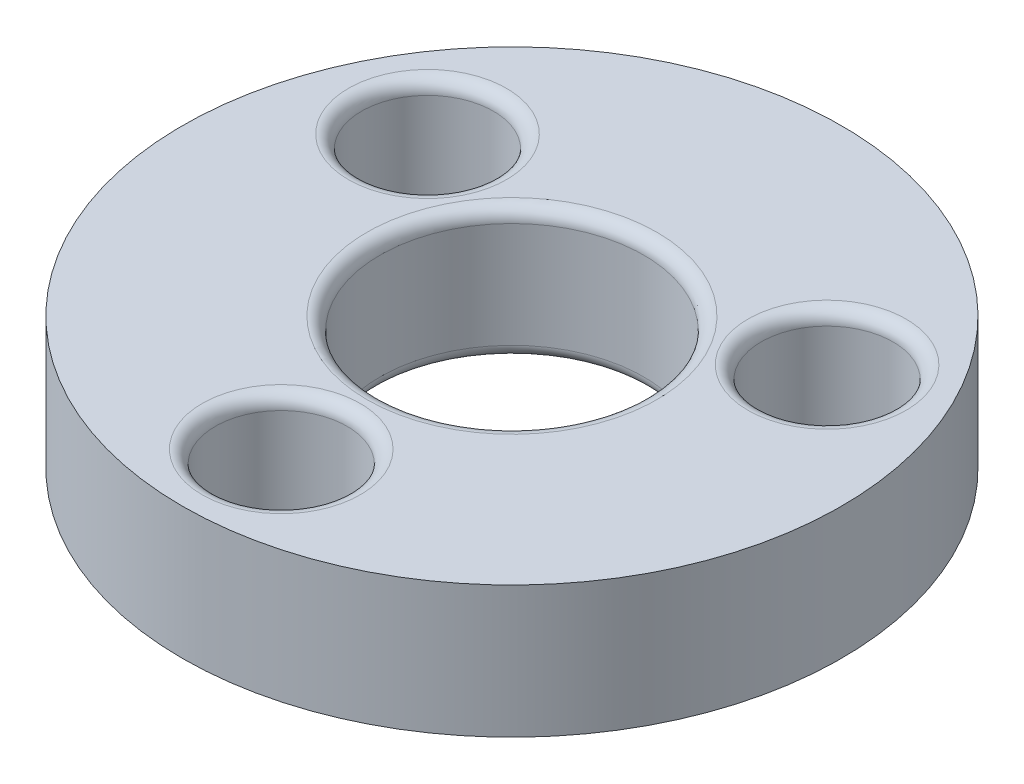
ISO-10303-21;
HEADER;
FILE_DESCRIPTION(('STEP AP214'),'2;1');
FILE_NAME('part.step','',(''),(''),'','','');
FILE_SCHEMA(('AUTOMOTIVE_DESIGN { 1 0 10303 214 1 1 1 1 }'));
ENDSEC;
DATA;
#1=APPLICATION_CONTEXT('core data for automotive mechanical design processes');
#2=APPLICATION_PROTOCOL_DEFINITION('international standard','automotive_design',2000,#1);
#3=PRODUCT_CONTEXT('',#1,'mechanical');
#4=PRODUCT('Part','Part','',(#3));
#5=PRODUCT_RELATED_PRODUCT_CATEGORY('part','',(#4));
#6=PRODUCT_DEFINITION_FORMATION('','',#4);
#7=PRODUCT_DEFINITION_CONTEXT('part definition',#1,'design');
#8=PRODUCT_DEFINITION('design','',#6,#7);
#9=PRODUCT_DEFINITION_SHAPE('','',#8);
#10=(LENGTH_UNIT() NAMED_UNIT(*) SI_UNIT(.MILLI.,.METRE.));
#11=(NAMED_UNIT(*) PLANE_ANGLE_UNIT() SI_UNIT($,.RADIAN.));
#12=(NAMED_UNIT(*) SI_UNIT($,.STERADIAN.) SOLID_ANGLE_UNIT());
#13=UNCERTAINTY_MEASURE_WITH_UNIT(LENGTH_MEASURE(1.E-05),#10,'distance_accuracy_value','');
#14=(GEOMETRIC_REPRESENTATION_CONTEXT(3) GLOBAL_UNCERTAINTY_ASSIGNED_CONTEXT((#13)) GLOBAL_UNIT_ASSIGNED_CONTEXT((#10,
#11,#12)) REPRESENTATION_CONTEXT('',''));
#15=CARTESIAN_POINT('',(0.,0.,0.));
#16=DIRECTION('',(0.,0.,1.));
#17=DIRECTION('',(1.,0.,0.));
#18=AXIS2_PLACEMENT_3D('',#15,#16,#17);
#19=CARTESIAN_POINT('',(0.,10.,0.));
#20=DIRECTION('',(0.,1.,0.));
#21=DIRECTION('',(0.,0.,1.));
#22=AXIS2_PLACEMENT_3D('',#19,#20,#21);
#23=PLANE('',#22);
#24=CARTESIAN_POINT('',(0.,10.,0.));
#25=DIRECTION('',(0.,1.,0.));
#26=DIRECTION('',(0.,0.,1.));
#27=AXIS2_PLACEMENT_3D('',#24,#25,#26);
#28=CIRCLE('',#27,11.);
#29=CARTESIAN_POINT('',(0.,10.,11.));
#30=VERTEX_POINT('',#29);
#31=EDGE_CURVE('E61',#30,#30,#28,.F.);
#32=ORIENTED_EDGE('',*,*,#31,.T.);
#33=EDGE_LOOP('',(#32));
#34=FACE_BOUND('',#33,.T.);
#35=CARTESIAN_POINT('',(0.,10.,17.5));
#36=DIRECTION('',(0.,1.,0.));
#37=DIRECTION('',(0.,0.,1.));
#38=AXIS2_PLACEMENT_3D('',#35,#36,#37);
#39=CIRCLE('',#38,6.);
#40=CARTESIAN_POINT('',(0.,10.,23.5));
#41=VERTEX_POINT('',#40);
#42=EDGE_CURVE('E64',#41,#41,#39,.F.);
#43=ORIENTED_EDGE('',*,*,#42,.T.);
#44=EDGE_LOOP('',(#43));
#45=FACE_BOUND('',#44,.T.);
#46=CARTESIAN_POINT('',(-15.1554445662266,10.,-8.75000000000065));
#47=DIRECTION('',(0.,1.,0.));
#48=DIRECTION('',(0.,0.,1.));
#49=AXIS2_PLACEMENT_3D('',#46,#47,#48);
#50=CIRCLE('',#49,6.00000000000141);
#51=CARTESIAN_POINT('',(-15.1554445662266,10.,-2.74999999999924));
#52=VERTEX_POINT('',#51);
#53=EDGE_CURVE('E67',#52,#52,#50,.F.);
#54=ORIENTED_EDGE('',*,*,#53,.T.);
#55=EDGE_LOOP('',(#54));
#56=FACE_BOUND('',#55,.T.);
#57=CARTESIAN_POINT('',(15.1554445662288,10.,-8.74999999999936));
#58=DIRECTION('',(0.,1.,0.));
#59=DIRECTION('',(0.,0.,1.));
#60=AXIS2_PLACEMENT_3D('',#57,#58,#59);
#61=CIRCLE('',#60,6.00000000000096);
#62=CARTESIAN_POINT('',(15.1554445662288,10.,-2.7499999999984));
#63=VERTEX_POINT('',#62);
#64=EDGE_CURVE('E70',#63,#63,#61,.F.);
#65=ORIENTED_EDGE('',*,*,#64,.T.);
#66=EDGE_LOOP('',(#65));
#67=FACE_BOUND('',#66,.T.);
#68=CARTESIAN_POINT('',(0.,10.,0.));
#69=DIRECTION('',(0.,1.,0.));
#70=DIRECTION('',(0.,0.,1.));
#71=AXIS2_PLACEMENT_3D('',#68,#69,#70);
#72=CIRCLE('',#71,25.);
#73=CARTESIAN_POINT('',(0.,10.,25.));
#74=VERTEX_POINT('',#73);
#75=EDGE_CURVE('E91',#74,#74,#72,.T.);
#76=ORIENTED_EDGE('',*,*,#75,.T.);
#77=EDGE_LOOP('',(#76));
#78=FACE_BOUND('',#77,.T.);
#79=ADVANCED_FACE('F35',(#34,#45,#56,#67,#78),#23,.T.);
#80=CARTESIAN_POINT('',(0.,0.,0.));
#81=DIRECTION('',(0.,1.,0.));
#82=DIRECTION('',(0.,0.,1.));
#83=AXIS2_PLACEMENT_3D('',#80,#81,#82);
#84=PLANE('',#83);
#85=CARTESIAN_POINT('',(0.,0.,0.));
#86=DIRECTION('',(0.,1.,0.));
#87=DIRECTION('',(0.,0.,1.));
#88=AXIS2_PLACEMENT_3D('',#85,#86,#87);
#89=CIRCLE('',#88,11.);
#90=CARTESIAN_POINT('',(0.,0.,11.));
#91=VERTEX_POINT('',#90);
#92=EDGE_CURVE('E79',#91,#91,#89,.T.);
#93=ORIENTED_EDGE('',*,*,#92,.T.);
#94=EDGE_LOOP('',(#93));
#95=FACE_BOUND('',#94,.T.);
#96=CARTESIAN_POINT('',(0.,0.,17.5));
#97=DIRECTION('',(0.,1.,0.));
#98=DIRECTION('',(0.,0.,1.));
#99=AXIS2_PLACEMENT_3D('',#96,#97,#98);
#100=CIRCLE('',#99,6.);
#101=CARTESIAN_POINT('',(0.,0.,23.5));
#102=VERTEX_POINT('',#101);
#103=EDGE_CURVE('E82',#102,#102,#100,.T.);
#104=ORIENTED_EDGE('',*,*,#103,.T.);
#105=EDGE_LOOP('',(#104));
#106=FACE_BOUND('',#105,.T.);
#107=CARTESIAN_POINT('',(-15.1554445662266,0.,-8.75000000000065));
#108=DIRECTION('',(0.,1.,0.));
#109=DIRECTION('',(0.,0.,1.));
#110=AXIS2_PLACEMENT_3D('',#107,#108,#109);
#111=CIRCLE('',#110,6.00000000000141);
#112=CARTESIAN_POINT('',(-15.1554445662266,0.,-2.74999999999924));
#113=VERTEX_POINT('',#112);
#114=EDGE_CURVE('E85',#113,#113,#111,.T.);
#115=ORIENTED_EDGE('',*,*,#114,.T.);
#116=EDGE_LOOP('',(#115));
#117=FACE_BOUND('',#116,.T.);
#118=CARTESIAN_POINT('',(15.1554445662288,0.,-8.74999999999936));
#119=DIRECTION('',(0.,1.,0.));
#120=DIRECTION('',(0.,0.,1.));
#121=AXIS2_PLACEMENT_3D('',#118,#119,#120);
#122=CIRCLE('',#121,6.00000000000096);
#123=CARTESIAN_POINT('',(15.1554445662288,0.,-2.7499999999984));
#124=VERTEX_POINT('',#123);
#125=EDGE_CURVE('E88',#124,#124,#122,.T.);
#126=ORIENTED_EDGE('',*,*,#125,.T.);
#127=EDGE_LOOP('',(#126));
#128=FACE_BOUND('',#127,.T.);
#129=CARTESIAN_POINT('',(0.,0.,0.));
#130=DIRECTION('',(0.,1.,0.));
#131=DIRECTION('',(0.,0.,1.));
#132=AXIS2_PLACEMENT_3D('',#129,#130,#131);
#133=CIRCLE('',#132,25.);
#134=CARTESIAN_POINT('',(0.,0.,25.));
#135=VERTEX_POINT('',#134);
#136=EDGE_CURVE('E92',#135,#135,#133,.T.);
#137=ORIENTED_EDGE('',*,*,#136,.F.);
#138=EDGE_LOOP('',(#137));
#139=FACE_BOUND('',#138,.T.);
#140=ADVANCED_FACE('F103',(#95,#106,#117,#128,#139),#84,.F.);
#141=CARTESIAN_POINT('',(0.,10.,0.));
#142=DIRECTION('',(0.,-1.,0.));
#143=DIRECTION('',(0.,0.,-1.));
#144=AXIS2_PLACEMENT_3D('',#141,#142,#143);
#145=CYLINDRICAL_SURFACE('',#144,25.);
#146=ORIENTED_EDGE('',*,*,#75,.F.);
#147=EDGE_LOOP('',(#146));
#148=FACE_BOUND('',#147,.T.);
#149=ORIENTED_EDGE('',*,*,#136,.T.);
#150=EDGE_LOOP('',(#149));
#151=FACE_BOUND('',#150,.T.);
#152=ADVANCED_FACE('F99',(#148,#151),#145,.T.);
#153=CARTESIAN_POINT('',(0.,10.,0.));
#154=DIRECTION('',(0.,-1.,0.));
#155=DIRECTION('',(0.,0.,-1.));
#156=AXIS2_PLACEMENT_3D('',#153,#154,#155);
#157=CYLINDRICAL_SURFACE('',#156,10.);
#158=CARTESIAN_POINT('',(0.,0.999999999999999,0.));
#159=DIRECTION('',(0.,1.,0.));
#160=DIRECTION('',(0.,0.,1.));
#161=AXIS2_PLACEMENT_3D('',#158,#159,#160);
#162=CIRCLE('',#161,10.);
#163=CARTESIAN_POINT('',(0.,0.999999999999999,10.));
#164=VERTEX_POINT('',#163);
#165=EDGE_CURVE('E73',#164,#164,#162,.F.);
#166=ORIENTED_EDGE('',*,*,#165,.T.);
#167=EDGE_LOOP('',(#166));
#168=FACE_BOUND('',#167,.T.);
#169=CARTESIAN_POINT('',(0.,9.,0.));
#170=DIRECTION('',(0.,1.,0.));
#171=DIRECTION('',(0.,0.,1.));
#172=AXIS2_PLACEMENT_3D('',#169,#170,#171);
#173=CIRCLE('',#172,10.);
#174=CARTESIAN_POINT('',(0.,9.,10.));
#175=VERTEX_POINT('',#174);
#176=EDGE_CURVE('E76',#175,#175,#173,.T.);
#177=ORIENTED_EDGE('',*,*,#176,.T.);
#178=EDGE_LOOP('',(#177));
#179=FACE_BOUND('',#178,.T.);
#180=ADVANCED_FACE('F102',(#168,#179),#157,.F.);
#181=CARTESIAN_POINT('',(-15.1554445662266,10.,-8.75000000000065));
#182=DIRECTION('',(0.,-1.,0.));
#183=DIRECTION('',(0.,0.,-1.));
#184=AXIS2_PLACEMENT_3D('',#181,#182,#183);
#185=CYLINDRICAL_SURFACE('',#184,5.00000000000141);
#186=CARTESIAN_POINT('',(-15.1554445662266,0.999999999999999,-8.75000000000065));
#187=DIRECTION('',(0.,1.,0.));
#188=DIRECTION('',(0.,0.,1.));
#189=AXIS2_PLACEMENT_3D('',#186,#187,#188);
#190=CIRCLE('',#189,5.00000000000141);
#191=CARTESIAN_POINT('',(-15.1554445662266,0.999999999999999,-3.74999999999924));
#192=VERTEX_POINT('',#191);
#193=EDGE_CURVE('E46',#192,#192,#190,.F.);
#194=ORIENTED_EDGE('',*,*,#193,.T.);
#195=EDGE_LOOP('',(#194));
#196=FACE_BOUND('',#195,.T.);
#197=CARTESIAN_POINT('',(-15.1554445662266,9.,-8.75000000000065));
#198=DIRECTION('',(0.,1.,0.));
#199=DIRECTION('',(0.,0.,1.));
#200=AXIS2_PLACEMENT_3D('',#197,#198,#199);
#201=CIRCLE('',#200,5.00000000000141);
#202=CARTESIAN_POINT('',(-15.1554445662266,9.,-3.74999999999924));
#203=VERTEX_POINT('',#202);
#204=EDGE_CURVE('E50',#203,#203,#201,.T.);
#205=ORIENTED_EDGE('',*,*,#204,.T.);
#206=EDGE_LOOP('',(#205));
#207=FACE_BOUND('',#206,.T.);
#208=ADVANCED_FACE('F225',(#196,#207),#185,.F.);
#209=CARTESIAN_POINT('',(15.1554445662288,10.,-8.74999999999936));
#210=DIRECTION('',(0.,-1.,0.));
#211=DIRECTION('',(0.,0.,-1.));
#212=AXIS2_PLACEMENT_3D('',#209,#210,#211);
#213=CYLINDRICAL_SURFACE('',#212,5.00000000000096);
#214=CARTESIAN_POINT('',(15.1554445662288,0.999999999999999,-8.74999999999936));
#215=DIRECTION('',(0.,1.,0.));
#216=DIRECTION('',(0.,0.,1.));
#217=AXIS2_PLACEMENT_3D('',#214,#215,#216);
#218=CIRCLE('',#217,5.00000000000096);
#219=CARTESIAN_POINT('',(15.1554445662288,0.999999999999999,-3.7499999999984));
#220=VERTEX_POINT('',#219);
#221=EDGE_CURVE('E10',#220,#220,#218,.F.);
#222=ORIENTED_EDGE('',*,*,#221,.T.);
#223=EDGE_LOOP('',(#222));
#224=FACE_BOUND('',#223,.T.);
#225=CARTESIAN_POINT('',(15.1554445662288,9.,-8.74999999999936));
#226=DIRECTION('',(0.,1.,0.));
#227=DIRECTION('',(0.,0.,1.));
#228=AXIS2_PLACEMENT_3D('',#225,#226,#227);
#229=CIRCLE('',#228,5.00000000000096);
#230=CARTESIAN_POINT('',(15.1554445662288,9.,-3.7499999999984));
#231=VERTEX_POINT('',#230);
#232=EDGE_CURVE('E42',#231,#231,#229,.T.);
#233=ORIENTED_EDGE('',*,*,#232,.T.);
#234=EDGE_LOOP('',(#233));
#235=FACE_BOUND('',#234,.T.);
#236=ADVANCED_FACE('F214',(#224,#235),#213,.F.);
#237=CARTESIAN_POINT('',(0.,10.,17.5));
#238=DIRECTION('',(0.,-1.,0.));
#239=DIRECTION('',(0.,0.,-1.));
#240=AXIS2_PLACEMENT_3D('',#237,#238,#239);
#241=CYLINDRICAL_SURFACE('',#240,5.);
#242=CARTESIAN_POINT('',(0.,0.999999999999999,17.5));
#243=DIRECTION('',(0.,1.,0.));
#244=DIRECTION('',(0.,0.,1.));
#245=AXIS2_PLACEMENT_3D('',#242,#243,#244);
#246=CIRCLE('',#245,5.);
#247=CARTESIAN_POINT('',(0.,0.999999999999999,22.5));
#248=VERTEX_POINT('',#247);
#249=EDGE_CURVE('E55',#248,#248,#246,.F.);
#250=ORIENTED_EDGE('',*,*,#249,.T.);
#251=EDGE_LOOP('',(#250));
#252=FACE_BOUND('',#251,.T.);
#253=CARTESIAN_POINT('',(0.,9.,17.5));
#254=DIRECTION('',(0.,1.,0.));
#255=DIRECTION('',(0.,0.,1.));
#256=AXIS2_PLACEMENT_3D('',#253,#254,#255);
#257=CIRCLE('',#256,5.);
#258=CARTESIAN_POINT('',(0.,9.,22.5));
#259=VERTEX_POINT('',#258);
#260=EDGE_CURVE('E58',#259,#259,#257,.T.);
#261=ORIENTED_EDGE('',*,*,#260,.T.);
#262=EDGE_LOOP('',(#261));
#263=FACE_BOUND('',#262,.T.);
#264=ADVANCED_FACE('F122',(#252,#263),#241,.F.);
#265=CARTESIAN_POINT('',(0.,0.999999999999999,0.));
#266=DIRECTION('',(0.,1.,0.));
#267=DIRECTION('',(0.,0.,1.));
#268=AXIS2_PLACEMENT_3D('',#265,#266,#267);
#269=TOROIDAL_SURFACE('',#268,11.,1.);
#270=ORIENTED_EDGE('',*,*,#165,.F.);
#271=EDGE_LOOP('',(#270));
#272=FACE_BOUND('',#271,.T.);
#273=ORIENTED_EDGE('',*,*,#92,.F.);
#274=EDGE_LOOP('',(#273));
#275=FACE_BOUND('',#274,.T.);
#276=ADVANCED_FACE('F118',(#272,#275),#269,.T.);
#277=CARTESIAN_POINT('',(0.,9.,0.));
#278=DIRECTION('',(0.,1.,0.));
#279=DIRECTION('',(0.,0.,1.));
#280=AXIS2_PLACEMENT_3D('',#277,#278,#279);
#281=TOROIDAL_SURFACE('',#280,11.,1.);
#282=ORIENTED_EDGE('',*,*,#31,.F.);
#283=EDGE_LOOP('',(#282));
#284=FACE_BOUND('',#283,.T.);
#285=ORIENTED_EDGE('',*,*,#176,.F.);
#286=EDGE_LOOP('',(#285));
#287=FACE_BOUND('',#286,.T.);
#288=ADVANCED_FACE('F121',(#284,#287),#281,.T.);
#289=CARTESIAN_POINT('',(0.,0.999999999999999,17.5));
#290=DIRECTION('',(0.,1.,0.));
#291=DIRECTION('',(0.,0.,1.));
#292=AXIS2_PLACEMENT_3D('',#289,#290,#291);
#293=TOROIDAL_SURFACE('',#292,6.,1.);
#294=ORIENTED_EDGE('',*,*,#103,.F.);
#295=EDGE_LOOP('',(#294));
#296=FACE_BOUND('',#295,.T.);
#297=ORIENTED_EDGE('',*,*,#249,.F.);
#298=EDGE_LOOP('',(#297));
#299=FACE_BOUND('',#298,.T.);
#300=ADVANCED_FACE('F126',(#296,#299),#293,.T.);
#301=CARTESIAN_POINT('',(0.,9.,17.5));
#302=DIRECTION('',(0.,1.,0.));
#303=DIRECTION('',(0.,0.,1.));
#304=AXIS2_PLACEMENT_3D('',#301,#302,#303);
#305=TOROIDAL_SURFACE('',#304,6.,1.);
#306=ORIENTED_EDGE('',*,*,#260,.F.);
#307=EDGE_LOOP('',(#306));
#308=FACE_BOUND('',#307,.T.);
#309=ORIENTED_EDGE('',*,*,#42,.F.);
#310=EDGE_LOOP('',(#309));
#311=FACE_BOUND('',#310,.T.);
#312=ADVANCED_FACE('F130',(#308,#311),#305,.T.);
#313=CARTESIAN_POINT('',(-15.1554445662266,0.999999999999999,-8.75000000000065));
#314=DIRECTION('',(0.,1.,0.));
#315=DIRECTION('',(0.,0.,1.));
#316=AXIS2_PLACEMENT_3D('',#313,#314,#315);
#317=TOROIDAL_SURFACE('',#316,6.00000000000141,1.);
#318=ORIENTED_EDGE('',*,*,#114,.F.);
#319=EDGE_LOOP('',(#318));
#320=FACE_BOUND('',#319,.T.);
#321=ORIENTED_EDGE('',*,*,#193,.F.);
#322=EDGE_LOOP('',(#321));
#323=FACE_BOUND('',#322,.T.);
#324=ADVANCED_FACE('F134',(#320,#323),#317,.T.);
#325=CARTESIAN_POINT('',(-15.1554445662266,9.,-8.75000000000065));
#326=DIRECTION('',(0.,1.,0.));
#327=DIRECTION('',(0.,0.,1.));
#328=AXIS2_PLACEMENT_3D('',#325,#326,#327);
#329=TOROIDAL_SURFACE('',#328,6.00000000000141,1.);
#330=ORIENTED_EDGE('',*,*,#204,.F.);
#331=EDGE_LOOP('',(#330));
#332=FACE_BOUND('',#331,.T.);
#333=ORIENTED_EDGE('',*,*,#53,.F.);
#334=EDGE_LOOP('',(#333));
#335=FACE_BOUND('',#334,.T.);
#336=ADVANCED_FACE('F138',(#332,#335),#329,.T.);
#337=CARTESIAN_POINT('',(15.1554445662288,0.999999999999999,-8.74999999999936));
#338=DIRECTION('',(0.,1.,0.));
#339=DIRECTION('',(0.,0.,1.));
#340=AXIS2_PLACEMENT_3D('',#337,#338,#339);
#341=TOROIDAL_SURFACE('',#340,6.00000000000096,1.);
#342=ORIENTED_EDGE('',*,*,#125,.F.);
#343=EDGE_LOOP('',(#342));
#344=FACE_BOUND('',#343,.T.);
#345=ORIENTED_EDGE('',*,*,#221,.F.);
#346=EDGE_LOOP('',(#345));
#347=FACE_BOUND('',#346,.T.);
#348=ADVANCED_FACE('F141',(#344,#347),#341,.T.);
#349=CARTESIAN_POINT('',(15.1554445662288,9.,-8.74999999999936));
#350=DIRECTION('',(0.,1.,0.));
#351=DIRECTION('',(0.,0.,1.));
#352=AXIS2_PLACEMENT_3D('',#349,#350,#351);
#353=TOROIDAL_SURFACE('',#352,6.00000000000096,1.);
#354=ORIENTED_EDGE('',*,*,#232,.F.);
#355=EDGE_LOOP('',(#354));
#356=FACE_BOUND('',#355,.T.);
#357=ORIENTED_EDGE('',*,*,#64,.F.);
#358=EDGE_LOOP('',(#357));
#359=FACE_BOUND('',#358,.T.);
#360=ADVANCED_FACE('F37',(#356,#359),#353,.T.);
#361=CLOSED_SHELL('',(#79,#140,#152,#180,#208,#236,#264,#276,#288,#300,#312,#324,#336,#348,#360));
#362=MANIFOLD_SOLID_BREP('B2',#361);
#363=ADVANCED_BREP_SHAPE_REPRESENTATION('',(#18,#362),#14);
#364=SHAPE_DEFINITION_REPRESENTATION(#9,#363);
ENDSEC;
END-ISO-10303-21;
